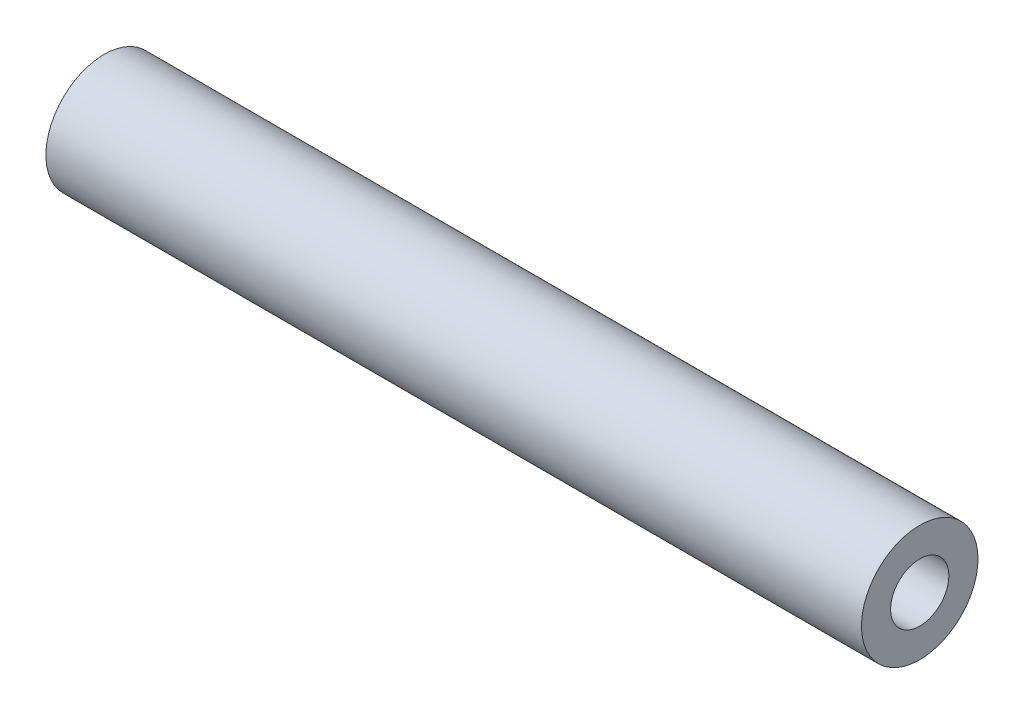
ISO-10303-21;
HEADER;
FILE_DESCRIPTION(('STEP AP214'),'2;1');
FILE_NAME('part.step','',(''),(''),'','','');
FILE_SCHEMA(('AUTOMOTIVE_DESIGN { 1 0 10303 214 1 1 1 1 }'));
ENDSEC;
DATA;
#1=APPLICATION_CONTEXT('core data for automotive mechanical design processes');
#2=APPLICATION_PROTOCOL_DEFINITION('international standard','automotive_design',2000,#1);
#3=PRODUCT_CONTEXT('',#1,'mechanical');
#4=PRODUCT('Part','Part','',(#3));
#5=PRODUCT_RELATED_PRODUCT_CATEGORY('part','',(#4));
#6=PRODUCT_DEFINITION_FORMATION('','',#4);
#7=PRODUCT_DEFINITION_CONTEXT('part definition',#1,'design');
#8=PRODUCT_DEFINITION('design','',#6,#7);
#9=PRODUCT_DEFINITION_SHAPE('','',#8);
#10=(LENGTH_UNIT() NAMED_UNIT(*) SI_UNIT(.MILLI.,.METRE.));
#11=(NAMED_UNIT(*) PLANE_ANGLE_UNIT() SI_UNIT($,.RADIAN.));
#12=(NAMED_UNIT(*) SI_UNIT($,.STERADIAN.) SOLID_ANGLE_UNIT());
#13=UNCERTAINTY_MEASURE_WITH_UNIT(LENGTH_MEASURE(1.E-05),#10,'distance_accuracy_value','');
#14=(GEOMETRIC_REPRESENTATION_CONTEXT(3) GLOBAL_UNCERTAINTY_ASSIGNED_CONTEXT((#13)) GLOBAL_UNIT_ASSIGNED_CONTEXT((#10,
#11,#12)) REPRESENTATION_CONTEXT('',''));
#15=CARTESIAN_POINT('',(0.,0.,0.));
#16=DIRECTION('',(0.,0.,1.));
#17=DIRECTION('',(1.,0.,0.));
#18=AXIS2_PLACEMENT_3D('',#15,#16,#17);
#19=CARTESIAN_POINT('',(177.8,0.,0.));
#20=DIRECTION('',(1.,0.,0.));
#21=DIRECTION('',(0.,0.,-1.));
#22=AXIS2_PLACEMENT_3D('',#19,#20,#21);
#23=PLANE('',#22);
#24=CARTESIAN_POINT('',(177.8,0.,0.));
#25=DIRECTION('',(1.,0.,0.));
#26=DIRECTION('',(0.,0.,-1.));
#27=AXIS2_PLACEMENT_3D('',#24,#25,#26);
#28=CIRCLE('',#27,12.7);
#29=CARTESIAN_POINT('',(177.8,0.,-12.7));
#30=VERTEX_POINT('',#29);
#31=EDGE_CURVE('E10',#30,#30,#28,.T.);
#32=ORIENTED_EDGE('',*,*,#31,.T.);
#33=EDGE_LOOP('',(#32));
#34=FACE_BOUND('',#33,.T.);
#35=CARTESIAN_POINT('',(177.8,0.,0.));
#36=DIRECTION('',(1.,0.,0.));
#37=DIRECTION('',(0.,0.,-1.));
#38=AXIS2_PLACEMENT_3D('',#35,#36,#37);
#39=CIRCLE('',#38,6.35);
#40=CARTESIAN_POINT('',(177.8,0.,-6.35));
#41=VERTEX_POINT('',#40);
#42=EDGE_CURVE('E42',#41,#41,#39,.T.);
#43=ORIENTED_EDGE('',*,*,#42,.F.);
#44=EDGE_LOOP('',(#43));
#45=FACE_BOUND('',#44,.T.);
#46=ADVANCED_FACE('F31',(#34,#45),#23,.T.);
#47=CARTESIAN_POINT('',(0.,0.,0.));
#48=DIRECTION('',(1.,0.,0.));
#49=DIRECTION('',(0.,0.,-1.));
#50=AXIS2_PLACEMENT_3D('',#47,#48,#49);
#51=PLANE('',#50);
#52=CARTESIAN_POINT('',(0.,0.,0.));
#53=DIRECTION('',(1.,0.,0.));
#54=DIRECTION('',(0.,0.,-1.));
#55=AXIS2_PLACEMENT_3D('',#52,#53,#54);
#56=CIRCLE('',#55,12.7);
#57=CARTESIAN_POINT('',(0.,0.,-12.7));
#58=VERTEX_POINT('',#57);
#59=EDGE_CURVE('E35',#58,#58,#56,.T.);
#60=ORIENTED_EDGE('',*,*,#59,.F.);
#61=EDGE_LOOP('',(#60));
#62=FACE_BOUND('',#61,.T.);
#63=CARTESIAN_POINT('',(0.,0.,0.));
#64=DIRECTION('',(1.,0.,0.));
#65=DIRECTION('',(0.,0.,-1.));
#66=AXIS2_PLACEMENT_3D('',#63,#64,#65);
#67=CIRCLE('',#66,6.35);
#68=CARTESIAN_POINT('',(0.,0.,-6.35));
#69=VERTEX_POINT('',#68);
#70=EDGE_CURVE('E44',#69,#69,#67,.T.);
#71=ORIENTED_EDGE('',*,*,#70,.T.);
#72=EDGE_LOOP('',(#71));
#73=FACE_BOUND('',#72,.T.);
#74=ADVANCED_FACE('F54',(#62,#73),#51,.F.);
#75=CARTESIAN_POINT('',(177.8,0.,0.));
#76=DIRECTION('',(-1.,0.,0.));
#77=DIRECTION('',(0.,0.,1.));
#78=AXIS2_PLACEMENT_3D('',#75,#76,#77);
#79=CYLINDRICAL_SURFACE('',#78,12.7);
#80=ORIENTED_EDGE('',*,*,#31,.F.);
#81=EDGE_LOOP('',(#80));
#82=FACE_BOUND('',#81,.T.);
#83=ORIENTED_EDGE('',*,*,#59,.T.);
#84=EDGE_LOOP('',(#83));
#85=FACE_BOUND('',#84,.T.);
#86=ADVANCED_FACE('F33',(#82,#85),#79,.T.);
#87=CARTESIAN_POINT('',(177.8,0.,0.));
#88=DIRECTION('',(-1.,0.,0.));
#89=DIRECTION('',(0.,0.,1.));
#90=AXIS2_PLACEMENT_3D('',#87,#88,#89);
#91=CYLINDRICAL_SURFACE('',#90,6.35);
#92=ORIENTED_EDGE('',*,*,#42,.T.);
#93=EDGE_LOOP('',(#92));
#94=FACE_BOUND('',#93,.T.);
#95=ORIENTED_EDGE('',*,*,#70,.F.);
#96=EDGE_LOOP('',(#95));
#97=FACE_BOUND('',#96,.T.);
#98=ADVANCED_FACE('F50',(#94,#97),#91,.F.);
#99=CLOSED_SHELL('',(#46,#74,#86,#98));
#100=MANIFOLD_SOLID_BREP('B2',#99);
#101=ADVANCED_BREP_SHAPE_REPRESENTATION('',(#18,#100),#14);
#102=SHAPE_DEFINITION_REPRESENTATION(#9,#101);
ENDSEC;
END-ISO-10303-21;
